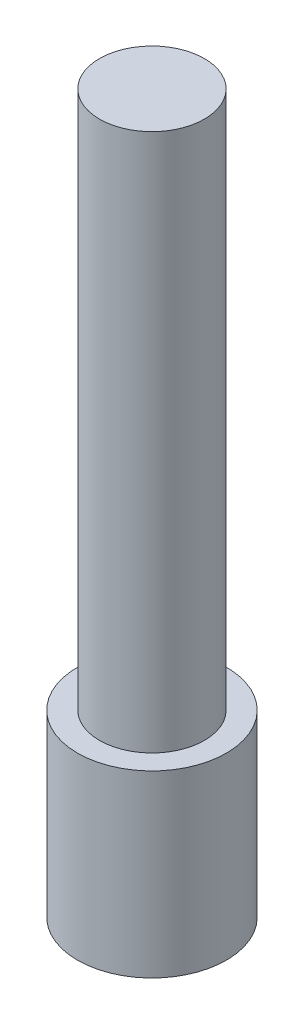
ISO-10303-21;
HEADER;
FILE_DESCRIPTION(('STEP AP214'),'2;1');
FILE_NAME('part.step','',(''),(''),'','','');
FILE_SCHEMA(('AUTOMOTIVE_DESIGN { 1 0 10303 214 1 1 1 1 }'));
ENDSEC;
DATA;
#1=APPLICATION_CONTEXT('core data for automotive mechanical design processes');
#2=APPLICATION_PROTOCOL_DEFINITION('international standard','automotive_design',2000,#1);
#3=PRODUCT_CONTEXT('',#1,'mechanical');
#4=PRODUCT('Part','Part','',(#3));
#5=PRODUCT_RELATED_PRODUCT_CATEGORY('part','',(#4));
#6=PRODUCT_DEFINITION_FORMATION('','',#4);
#7=PRODUCT_DEFINITION_CONTEXT('part definition',#1,'design');
#8=PRODUCT_DEFINITION('design','',#6,#7);
#9=PRODUCT_DEFINITION_SHAPE('','',#8);
#10=(LENGTH_UNIT() NAMED_UNIT(*) SI_UNIT(.MILLI.,.METRE.));
#11=(NAMED_UNIT(*) PLANE_ANGLE_UNIT() SI_UNIT($,.RADIAN.));
#12=(NAMED_UNIT(*) SI_UNIT($,.STERADIAN.) SOLID_ANGLE_UNIT());
#13=UNCERTAINTY_MEASURE_WITH_UNIT(LENGTH_MEASURE(1.E-05),#10,'distance_accuracy_value','');
#14=(GEOMETRIC_REPRESENTATION_CONTEXT(3) GLOBAL_UNCERTAINTY_ASSIGNED_CONTEXT((#13)) GLOBAL_UNIT_ASSIGNED_CONTEXT((#10,
#11,#12)) REPRESENTATION_CONTEXT('',''));
#15=CARTESIAN_POINT('',(0.,0.,0.));
#16=DIRECTION('',(0.,0.,1.));
#17=DIRECTION('',(1.,0.,0.));
#18=AXIS2_PLACEMENT_3D('',#15,#16,#17);
#19=CARTESIAN_POINT('',(0.,-10.,0.));
#20=DIRECTION('',(0.,1.,0.));
#21=DIRECTION('',(0.,0.,1.));
#22=AXIS2_PLACEMENT_3D('',#19,#20,#21);
#23=CYLINDRICAL_SURFACE('',#22,4.15);
#24=CARTESIAN_POINT('',(0.,-10.,0.));
#25=DIRECTION('',(0.,1.,0.));
#26=DIRECTION('',(0.,0.,1.));
#27=AXIS2_PLACEMENT_3D('',#24,#25,#26);
#28=CIRCLE('',#27,4.15);
#29=CARTESIAN_POINT('',(0.,-10.,4.15));
#30=VERTEX_POINT('',#29);
#31=EDGE_CURVE('E11',#30,#30,#28,.T.);
#32=ORIENTED_EDGE('',*,*,#31,.T.);
#33=EDGE_LOOP('',(#32));
#34=FACE_BOUND('',#33,.T.);
#35=CARTESIAN_POINT('',(0.,0.,0.));
#36=DIRECTION('',(0.,1.,0.));
#37=DIRECTION('',(0.,0.,1.));
#38=AXIS2_PLACEMENT_3D('',#35,#36,#37);
#39=CIRCLE('',#38,4.15);
#40=CARTESIAN_POINT('',(0.,0.,4.15));
#41=VERTEX_POINT('',#40);
#42=EDGE_CURVE('E54',#41,#41,#39,.T.);
#43=ORIENTED_EDGE('',*,*,#42,.F.);
#44=EDGE_LOOP('',(#43));
#45=FACE_BOUND('',#44,.T.);
#46=ADVANCED_FACE('F51',(#34,#45),#23,.T.);
#47=CARTESIAN_POINT('',(0.,-10.,0.));
#48=DIRECTION('',(0.,1.,0.));
#49=DIRECTION('',(0.,0.,1.));
#50=AXIS2_PLACEMENT_3D('',#47,#48,#49);
#51=PLANE('',#50);
#52=CARTESIAN_POINT('',(0.,-10.,0.));
#53=DIRECTION('',(0.,1.,0.));
#54=DIRECTION('',(0.,0.,1.));
#55=AXIS2_PLACEMENT_3D('',#52,#53,#54);
#56=CIRCLE('',#55,2.925);
#57=CARTESIAN_POINT('',(0.,-10.,2.925));
#58=VERTEX_POINT('',#57);
#59=EDGE_CURVE('E61',#58,#58,#56,.T.);
#60=ORIENTED_EDGE('',*,*,#59,.T.);
#61=EDGE_LOOP('',(#60));
#62=FACE_BOUND('',#61,.T.);
#63=ORIENTED_EDGE('',*,*,#31,.F.);
#64=EDGE_LOOP('',(#63));
#65=FACE_BOUND('',#64,.T.);
#66=ADVANCED_FACE('F69',(#62,#65),#51,.F.);
#67=CARTESIAN_POINT('',(0.,0.,0.));
#68=DIRECTION('',(0.,1.,0.));
#69=DIRECTION('',(0.,0.,1.));
#70=AXIS2_PLACEMENT_3D('',#67,#68,#69);
#71=PLANE('',#70);
#72=CARTESIAN_POINT('',(0.,0.,0.));
#73=DIRECTION('',(0.,1.,0.));
#74=DIRECTION('',(0.,0.,1.));
#75=AXIS2_PLACEMENT_3D('',#72,#73,#74);
#76=CIRCLE('',#75,2.925);
#77=CARTESIAN_POINT('',(0.,0.,2.925));
#78=VERTEX_POINT('',#77);
#79=EDGE_CURVE('E63',#78,#78,#76,.T.);
#80=ORIENTED_EDGE('',*,*,#79,.F.);
#81=EDGE_LOOP('',(#80));
#82=FACE_BOUND('',#81,.T.);
#83=ORIENTED_EDGE('',*,*,#42,.T.);
#84=EDGE_LOOP('',(#83));
#85=FACE_BOUND('',#84,.T.);
#86=ADVANCED_FACE('F75',(#82,#85),#71,.T.);
#87=CARTESIAN_POINT('',(0.,-10.,0.));
#88=DIRECTION('',(0.,1.,0.));
#89=DIRECTION('',(0.,0.,1.));
#90=AXIS2_PLACEMENT_3D('',#87,#88,#89);
#91=CYLINDRICAL_SURFACE('',#90,2.925);
#92=ORIENTED_EDGE('',*,*,#59,.F.);
#93=EDGE_LOOP('',(#92));
#94=FACE_BOUND('',#93,.T.);
#95=ORIENTED_EDGE('',*,*,#79,.T.);
#96=EDGE_LOOP('',(#95));
#97=FACE_BOUND('',#96,.T.);
#98=ADVANCED_FACE('F72',(#94,#97),#91,.F.);
#99=CLOSED_SHELL('',(#46,#66,#86,#98));
#100=MANIFOLD_SOLID_BREP('B2',#99);
#101=CARTESIAN_POINT('',(0.,30.,0.));
#102=DIRECTION('',(0.,-1.,0.));
#103=DIRECTION('',(0.,0.,-1.));
#104=AXIS2_PLACEMENT_3D('',#101,#102,#103);
#105=CYLINDRICAL_SURFACE('',#104,2.925);
#106=CARTESIAN_POINT('',(0.,30.,0.));
#107=DIRECTION('',(0.,1.,0.));
#108=DIRECTION('',(0.,0.,1.));
#109=AXIS2_PLACEMENT_3D('',#106,#107,#108);
#110=CIRCLE('',#109,2.925);
#111=CARTESIAN_POINT('',(0.,30.,2.925));
#112=VERTEX_POINT('',#111);
#113=EDGE_CURVE('E50',#112,#112,#110,.T.);
#114=ORIENTED_EDGE('',*,*,#113,.F.);
#115=EDGE_LOOP('',(#114));
#116=FACE_BOUND('',#115,.T.);
#117=CARTESIAN_POINT('',(0.,0.,0.));
#118=DIRECTION('',(0.,1.,0.));
#119=DIRECTION('',(0.,0.,1.));
#120=AXIS2_PLACEMENT_3D('',#117,#118,#119);
#121=CIRCLE('',#120,2.925);
#122=CARTESIAN_POINT('',(0.,0.,2.925));
#123=VERTEX_POINT('',#122);
#124=EDGE_CURVE('E116',#123,#123,#121,.T.);
#125=ORIENTED_EDGE('',*,*,#124,.T.);
#126=EDGE_LOOP('',(#125));
#127=FACE_BOUND('',#126,.T.);
#128=ADVANCED_FACE('F113',(#116,#127),#105,.T.);
#129=CARTESIAN_POINT('',(0.,30.,0.));
#130=DIRECTION('',(0.,1.,0.));
#131=DIRECTION('',(0.,0.,1.));
#132=AXIS2_PLACEMENT_3D('',#129,#130,#131);
#133=PLANE('',#132);
#134=ORIENTED_EDGE('',*,*,#113,.T.);
#135=EDGE_LOOP('',(#134));
#136=FACE_BOUND('',#135,.T.);
#137=ADVANCED_FACE('F130',(#136),#133,.T.);
#138=CARTESIAN_POINT('',(0.,0.,0.));
#139=DIRECTION('',(0.,1.,0.));
#140=DIRECTION('',(0.,0.,1.));
#141=AXIS2_PLACEMENT_3D('',#138,#139,#140);
#142=PLANE('',#141);
#143=ORIENTED_EDGE('',*,*,#124,.F.);
#144=EDGE_LOOP('',(#143));
#145=FACE_BOUND('',#144,.T.);
#146=ADVANCED_FACE('F128',(#145),#142,.F.);
#147=CLOSED_SHELL('',(#128,#137,#146));
#148=MANIFOLD_SOLID_BREP('B6',#147);
#149=ADVANCED_BREP_SHAPE_REPRESENTATION('',(#18,#100,#148),#14);
#150=SHAPE_DEFINITION_REPRESENTATION(#9,#149);
ENDSEC;
END-ISO-10303-21;
